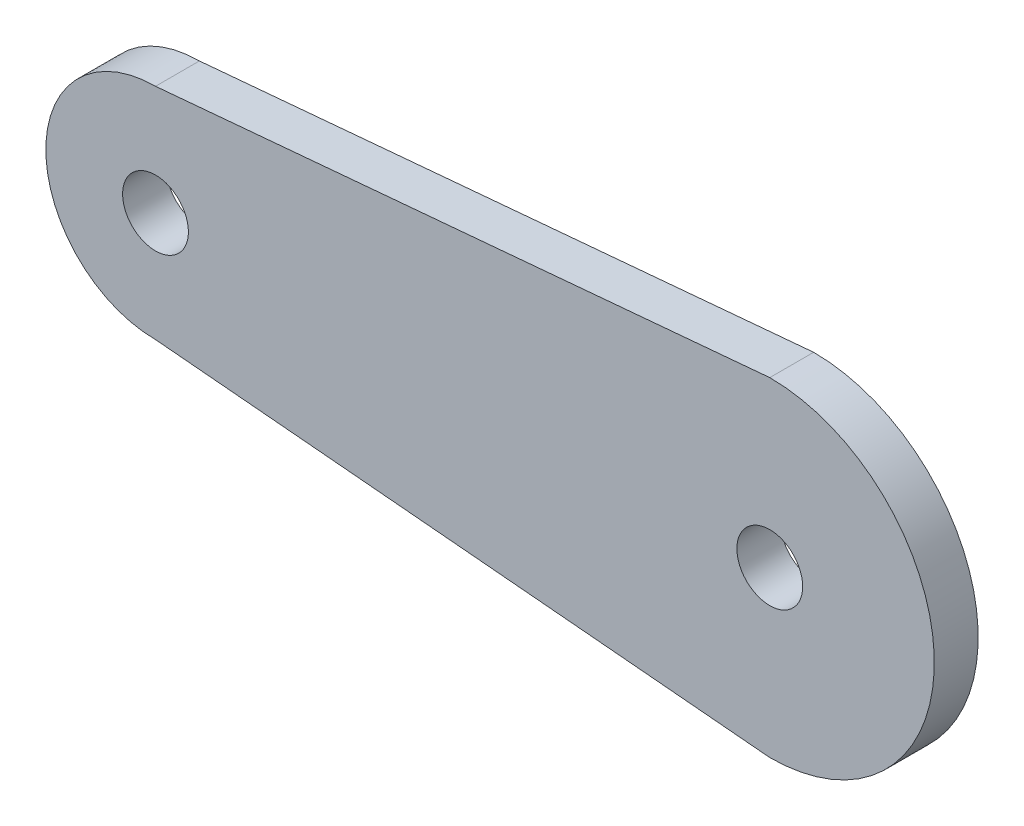
ISO-10303-21;
HEADER;
FILE_DESCRIPTION(('STEP AP214'),'2;1');
FILE_NAME('part.step','',(''),(''),'','','');
FILE_SCHEMA(('AUTOMOTIVE_DESIGN { 1 0 10303 214 1 1 1 1 }'));
ENDSEC;
DATA;
#1=APPLICATION_CONTEXT('core data for automotive mechanical design processes');
#2=APPLICATION_PROTOCOL_DEFINITION('international standard','automotive_design',2000,#1);
#3=PRODUCT_CONTEXT('',#1,'mechanical');
#4=PRODUCT('Part','Part','',(#3));
#5=PRODUCT_RELATED_PRODUCT_CATEGORY('part','',(#4));
#6=PRODUCT_DEFINITION_FORMATION('','',#4);
#7=PRODUCT_DEFINITION_CONTEXT('part definition',#1,'design');
#8=PRODUCT_DEFINITION('design','',#6,#7);
#9=PRODUCT_DEFINITION_SHAPE('','',#8);
#10=(LENGTH_UNIT() NAMED_UNIT(*) SI_UNIT(.MILLI.,.METRE.));
#11=(NAMED_UNIT(*) PLANE_ANGLE_UNIT() SI_UNIT($,.RADIAN.));
#12=(NAMED_UNIT(*) SI_UNIT($,.STERADIAN.) SOLID_ANGLE_UNIT());
#13=UNCERTAINTY_MEASURE_WITH_UNIT(LENGTH_MEASURE(1.E-05),#10,'distance_accuracy_value','');
#14=(GEOMETRIC_REPRESENTATION_CONTEXT(3) GLOBAL_UNCERTAINTY_ASSIGNED_CONTEXT((#13)) GLOBAL_UNIT_ASSIGNED_CONTEXT((#10,
#11,#12)) REPRESENTATION_CONTEXT('',''));
#15=CARTESIAN_POINT('',(0.,0.,0.));
#16=DIRECTION('',(0.,0.,1.));
#17=DIRECTION('',(1.,0.,0.));
#18=AXIS2_PLACEMENT_3D('',#15,#16,#17);
#19=CARTESIAN_POINT('',(28.,0.,16.));
#20=DIRECTION('',(0.,0.,-1.));
#21=DIRECTION('',(-1.,0.,0.));
#22=AXIS2_PLACEMENT_3D('',#19,#20,#21);
#23=CYLINDRICAL_SURFACE('',#22,7.5);
#24=CARTESIAN_POINT('',(28.,0.,14.));
#25=DIRECTION('',(0.,0.,1.));
#26=DIRECTION('',(1.,0.,0.));
#27=AXIS2_PLACEMENT_3D('',#24,#25,#26);
#28=CIRCLE('',#27,7.5);
#29=CARTESIAN_POINT('',(28.,7.5,14.));
#30=VERTEX_POINT('',#29);
#31=CARTESIAN_POINT('',(28.,-7.5,14.));
#32=VERTEX_POINT('',#31);
#33=EDGE_CURVE('E76',#30,#32,#28,.F.);
#34=ORIENTED_EDGE('',*,*,#33,.F.);
#35=DIRECTION('',(0.,0.,-1.));
#36=VECTOR('',#35,1.);
#37=CARTESIAN_POINT('',(28.,7.5,16.));
#38=LINE('',#37,#36);
#39=CARTESIAN_POINT('',(28.,7.5,16.));
#40=VERTEX_POINT('',#39);
#41=EDGE_CURVE('E100',#40,#30,#38,.T.);
#42=ORIENTED_EDGE('',*,*,#41,.F.);
#43=CARTESIAN_POINT('',(28.,0.,16.));
#44=DIRECTION('',(0.,0.,1.));
#45=DIRECTION('',(1.,0.,0.));
#46=AXIS2_PLACEMENT_3D('',#43,#44,#45);
#47=CIRCLE('',#46,7.5);
#48=CARTESIAN_POINT('',(28.,-7.5,16.));
#49=VERTEX_POINT('',#48);
#50=EDGE_CURVE('E97',#40,#49,#47,.F.);
#51=ORIENTED_EDGE('',*,*,#50,.T.);
#52=DIRECTION('',(0.,0.,-1.));
#53=VECTOR('',#52,1.);
#54=CARTESIAN_POINT('',(28.,-7.5,16.));
#55=LINE('',#54,#53);
#56=EDGE_CURVE('E43',#49,#32,#55,.T.);
#57=ORIENTED_EDGE('',*,*,#56,.T.);
#58=EDGE_LOOP('',(#34,#42,#51,#57));
#59=FACE_BOUND('',#58,.T.);
#60=ADVANCED_FACE('F39',(#59),#23,.T.);
#61=CARTESIAN_POINT('',(-0.442897817146473,4.96045555204049,16.));
#62=DIRECTION('',(-0.0889319379745055,0.996037705314462,0.));
#63=DIRECTION('',(-0.996037705314462,-0.0889319379745055,0.));
#64=AXIS2_PLACEMENT_3D('',#61,#62,#63);
#65=PLANE('',#64);
#66=DIRECTION('',(0.996037705314462,0.0889319379745055,0.));
#67=VECTOR('',#66,1.);
#68=CARTESIAN_POINT('',(-0.442897817146473,4.96045555204049,14.));
#69=LINE('',#68,#67);
#70=CARTESIAN_POINT('',(0.,5.,14.));
#71=VERTEX_POINT('',#70);
#72=EDGE_CURVE('E48',#71,#30,#69,.T.);
#73=ORIENTED_EDGE('',*,*,#72,.F.);
#74=DIRECTION('',(0.,0.,-1.));
#75=VECTOR('',#74,1.);
#76=CARTESIAN_POINT('',(0.,5.,16.));
#77=LINE('',#76,#75);
#78=CARTESIAN_POINT('',(0.,5.,16.));
#79=VERTEX_POINT('',#78);
#80=EDGE_CURVE('E110',#79,#71,#77,.T.);
#81=ORIENTED_EDGE('',*,*,#80,.F.);
#82=DIRECTION('',(0.996037705314462,0.0889319379745055,0.));
#83=VECTOR('',#82,1.);
#84=CARTESIAN_POINT('',(-0.442897817146473,4.96045555204049,16.));
#85=LINE('',#84,#83);
#86=EDGE_CURVE('E98',#79,#40,#85,.T.);
#87=ORIENTED_EDGE('',*,*,#86,.T.);
#88=ORIENTED_EDGE('',*,*,#41,.T.);
#89=EDGE_LOOP('',(#73,#81,#87,#88));
#90=FACE_BOUND('',#89,.T.);
#91=ADVANCED_FACE('F140',(#90),#65,.T.);
#92=CARTESIAN_POINT('',(0.,0.,16.));
#93=DIRECTION('',(0.,0.,-1.));
#94=DIRECTION('',(-1.,0.,0.));
#95=AXIS2_PLACEMENT_3D('',#92,#93,#94);
#96=CYLINDRICAL_SURFACE('',#95,5.);
#97=ORIENTED_EDGE('',*,*,#80,.T.);
#98=CARTESIAN_POINT('',(0.,0.,14.));
#99=DIRECTION('',(0.,0.,1.));
#100=DIRECTION('',(1.,0.,0.));
#101=AXIS2_PLACEMENT_3D('',#98,#99,#100);
#102=CIRCLE('',#101,5.);
#103=CARTESIAN_POINT('',(0.,-5.,14.));
#104=VERTEX_POINT('',#103);
#105=EDGE_CURVE('E61',#71,#104,#102,.T.);
#106=ORIENTED_EDGE('',*,*,#105,.T.);
#107=DIRECTION('',(0.,0.,-1.));
#108=VECTOR('',#107,1.);
#109=CARTESIAN_POINT('',(0.,-5.,16.));
#110=LINE('',#109,#108);
#111=CARTESIAN_POINT('',(0.,-5.,16.));
#112=VERTEX_POINT('',#111);
#113=EDGE_CURVE('E93',#112,#104,#110,.T.);
#114=ORIENTED_EDGE('',*,*,#113,.F.);
#115=CARTESIAN_POINT('',(0.,0.,16.));
#116=DIRECTION('',(0.,0.,1.));
#117=DIRECTION('',(1.,0.,0.));
#118=AXIS2_PLACEMENT_3D('',#115,#116,#117);
#119=CIRCLE('',#118,5.);
#120=EDGE_CURVE('E120',#79,#112,#119,.T.);
#121=ORIENTED_EDGE('',*,*,#120,.F.);
#122=EDGE_LOOP('',(#97,#106,#114,#121));
#123=FACE_BOUND('',#122,.T.);
#124=ADVANCED_FACE('F144',(#123),#96,.T.);
#125=CARTESIAN_POINT('',(28.,0.,16.));
#126=DIRECTION('',(0.,0.,-1.));
#127=DIRECTION('',(-1.,0.,0.));
#128=AXIS2_PLACEMENT_3D('',#125,#126,#127);
#129=CYLINDRICAL_SURFACE('',#128,1.5);
#130=CARTESIAN_POINT('',(28.,0.,14.));
#131=DIRECTION('',(0.,0.,1.));
#132=DIRECTION('',(1.,0.,0.));
#133=AXIS2_PLACEMENT_3D('',#130,#131,#132);
#134=CIRCLE('',#133,1.5);
#135=CARTESIAN_POINT('',(29.5,0.,14.));
#136=VERTEX_POINT('',#135);
#137=EDGE_CURVE('E84',#136,#136,#134,.T.);
#138=ORIENTED_EDGE('',*,*,#137,.F.);
#139=EDGE_LOOP('',(#138));
#140=FACE_BOUND('',#139,.T.);
#141=CARTESIAN_POINT('',(28.,0.,16.));
#142=DIRECTION('',(0.,0.,1.));
#143=DIRECTION('',(1.,0.,0.));
#144=AXIS2_PLACEMENT_3D('',#141,#142,#143);
#145=CIRCLE('',#144,1.5);
#146=CARTESIAN_POINT('',(29.5,0.,16.));
#147=VERTEX_POINT('',#146);
#148=EDGE_CURVE('E109',#147,#147,#145,.T.);
#149=ORIENTED_EDGE('',*,*,#148,.T.);
#150=EDGE_LOOP('',(#149));
#151=FACE_BOUND('',#150,.T.);
#152=ADVANCED_FACE('F150',(#140,#151),#129,.F.);
#153=CARTESIAN_POINT('',(-0.442897817146473,-4.96045555204049,16.));
#154=DIRECTION('',(0.0889319379745055,0.996037705314462,0.));
#155=DIRECTION('',(-0.996037705314462,0.0889319379745055,0.));
#156=AXIS2_PLACEMENT_3D('',#153,#154,#155);
#157=PLANE('',#156);
#158=ORIENTED_EDGE('',*,*,#113,.T.);
#159=DIRECTION('',(0.996037705314462,-0.0889319379745055,0.));
#160=VECTOR('',#159,1.);
#161=CARTESIAN_POINT('',(-0.442897817146473,-4.96045555204049,14.));
#162=LINE('',#161,#160);
#163=EDGE_CURVE('E80',#104,#32,#162,.T.);
#164=ORIENTED_EDGE('',*,*,#163,.T.);
#165=ORIENTED_EDGE('',*,*,#56,.F.);
#166=DIRECTION('',(0.996037705314462,-0.0889319379745055,0.));
#167=VECTOR('',#166,1.);
#168=CARTESIAN_POINT('',(-0.442897817146473,-4.96045555204049,16.));
#169=LINE('',#168,#167);
#170=EDGE_CURVE('E106',#112,#49,#169,.T.);
#171=ORIENTED_EDGE('',*,*,#170,.F.);
#172=EDGE_LOOP('',(#158,#164,#165,#171));
#173=FACE_BOUND('',#172,.T.);
#174=ADVANCED_FACE('F89',(#173),#157,.F.);
#175=CARTESIAN_POINT('',(0.,0.,16.));
#176=DIRECTION('',(0.,0.,-1.));
#177=DIRECTION('',(-1.,0.,0.));
#178=AXIS2_PLACEMENT_3D('',#175,#176,#177);
#179=CYLINDRICAL_SURFACE('',#178,1.5);
#180=CARTESIAN_POINT('',(0.,0.,14.));
#181=DIRECTION('',(0.,0.,1.));
#182=DIRECTION('',(1.,0.,0.));
#183=AXIS2_PLACEMENT_3D('',#180,#181,#182);
#184=CIRCLE('',#183,1.5);
#185=CARTESIAN_POINT('',(1.5,0.,14.));
#186=VERTEX_POINT('',#185);
#187=EDGE_CURVE('E11',#186,#186,#184,.T.);
#188=ORIENTED_EDGE('',*,*,#187,.F.);
#189=EDGE_LOOP('',(#188));
#190=FACE_BOUND('',#189,.T.);
#191=CARTESIAN_POINT('',(0.,0.,16.));
#192=DIRECTION('',(0.,0.,1.));
#193=DIRECTION('',(1.,0.,0.));
#194=AXIS2_PLACEMENT_3D('',#191,#192,#193);
#195=CIRCLE('',#194,1.5);
#196=CARTESIAN_POINT('',(1.5,0.,16.));
#197=VERTEX_POINT('',#196);
#198=EDGE_CURVE('E94',#197,#197,#195,.T.);
#199=ORIENTED_EDGE('',*,*,#198,.T.);
#200=EDGE_LOOP('',(#199));
#201=FACE_BOUND('',#200,.T.);
#202=ADVANCED_FACE('F41',(#190,#201),#179,.F.);
#203=CARTESIAN_POINT('',(0.,0.,16.));
#204=DIRECTION('',(0.,0.,1.));
#205=DIRECTION('',(1.,0.,0.));
#206=AXIS2_PLACEMENT_3D('',#203,#204,#205);
#207=PLANE('',#206);
#208=ORIENTED_EDGE('',*,*,#50,.F.);
#209=ORIENTED_EDGE('',*,*,#86,.F.);
#210=ORIENTED_EDGE('',*,*,#120,.T.);
#211=ORIENTED_EDGE('',*,*,#170,.T.);
#212=EDGE_LOOP('',(#208,#209,#210,#211));
#213=FACE_BOUND('',#212,.T.);
#214=ORIENTED_EDGE('',*,*,#148,.F.);
#215=EDGE_LOOP('',(#214));
#216=FACE_BOUND('',#215,.T.);
#217=ORIENTED_EDGE('',*,*,#198,.F.);
#218=EDGE_LOOP('',(#217));
#219=FACE_BOUND('',#218,.T.);
#220=ADVANCED_FACE('F128',(#213,#216,#219),#207,.T.);
#221=CARTESIAN_POINT('',(41.5858435918892,-7.5,14.));
#222=DIRECTION('',(0.,0.,1.));
#223=DIRECTION('',(1.,0.,0.));
#224=AXIS2_PLACEMENT_3D('',#221,#222,#223);
#225=PLANE('',#224);
#226=ORIENTED_EDGE('',*,*,#137,.T.);
#227=EDGE_LOOP('',(#226));
#228=FACE_BOUND('',#227,.T.);
#229=ORIENTED_EDGE('',*,*,#33,.T.);
#230=ORIENTED_EDGE('',*,*,#163,.F.);
#231=ORIENTED_EDGE('',*,*,#105,.F.);
#232=ORIENTED_EDGE('',*,*,#72,.T.);
#233=EDGE_LOOP('',(#229,#230,#231,#232));
#234=FACE_BOUND('',#233,.T.);
#235=ORIENTED_EDGE('',*,*,#187,.T.);
#236=EDGE_LOOP('',(#235));
#237=FACE_BOUND('',#236,.T.);
#238=ADVANCED_FACE('F78',(#228,#234,#237),#225,.F.);
#239=CLOSED_SHELL('',(#60,#91,#124,#152,#174,#202,#220,#238));
#240=MANIFOLD_SOLID_BREP('B2',#239);
#241=ADVANCED_BREP_SHAPE_REPRESENTATION('',(#18,#240),#14);
#242=SHAPE_DEFINITION_REPRESENTATION(#9,#241);
ENDSEC;
END-ISO-10303-21;
